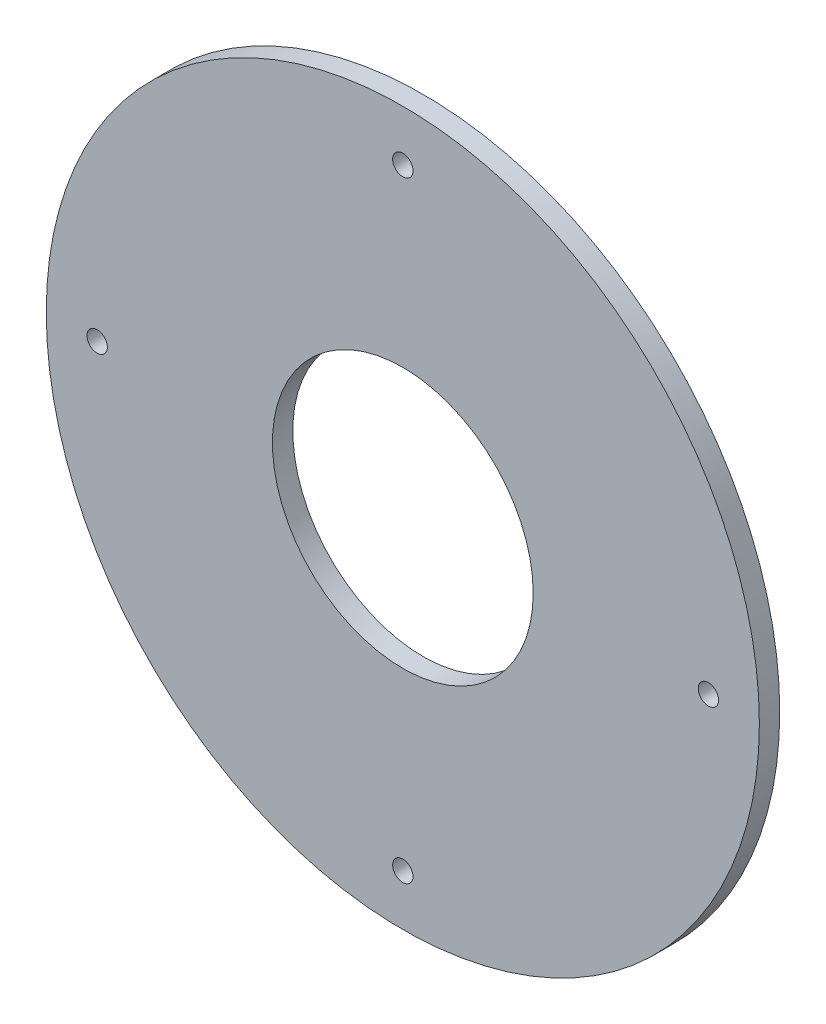
ISO-10303-21;
HEADER;
FILE_DESCRIPTION(('STEP AP214'),'2;1');
FILE_NAME('part.step','',(''),(''),'','','');
FILE_SCHEMA(('AUTOMOTIVE_DESIGN { 1 0 10303 214 1 1 1 1 }'));
ENDSEC;
DATA;
#1=APPLICATION_CONTEXT('core data for automotive mechanical design processes');
#2=APPLICATION_PROTOCOL_DEFINITION('international standard','automotive_design',2000,#1);
#3=PRODUCT_CONTEXT('',#1,'mechanical');
#4=PRODUCT('Part','Part','',(#3));
#5=PRODUCT_RELATED_PRODUCT_CATEGORY('part','',(#4));
#6=PRODUCT_DEFINITION_FORMATION('','',#4);
#7=PRODUCT_DEFINITION_CONTEXT('part definition',#1,'design');
#8=PRODUCT_DEFINITION('design','',#6,#7);
#9=PRODUCT_DEFINITION_SHAPE('','',#8);
#10=(LENGTH_UNIT() NAMED_UNIT(*) SI_UNIT(.MILLI.,.METRE.));
#11=(NAMED_UNIT(*) PLANE_ANGLE_UNIT() SI_UNIT($,.RADIAN.));
#12=(NAMED_UNIT(*) SI_UNIT($,.STERADIAN.) SOLID_ANGLE_UNIT());
#13=UNCERTAINTY_MEASURE_WITH_UNIT(LENGTH_MEASURE(1.E-05),#10,'distance_accuracy_value','');
#14=(GEOMETRIC_REPRESENTATION_CONTEXT(3) GLOBAL_UNCERTAINTY_ASSIGNED_CONTEXT((#13)) GLOBAL_UNIT_ASSIGNED_CONTEXT((#10,
#11,#12)) REPRESENTATION_CONTEXT('',''));
#15=CARTESIAN_POINT('',(0.,0.,0.));
#16=DIRECTION('',(0.,0.,1.));
#17=DIRECTION('',(1.,0.,0.));
#18=AXIS2_PLACEMENT_3D('',#15,#16,#17);
#19=CARTESIAN_POINT('',(7.51863873740927,-0.377040866930098,0.));
#20=DIRECTION('',(0.,0.,1.));
#21=DIRECTION('',(1.,0.,0.));
#22=AXIS2_PLACEMENT_3D('',#19,#20,#21);
#23=PLANE('',#22);
#24=CARTESIAN_POINT('',(82.5186387374093,-0.377040866930096,0.));
#25=DIRECTION('',(0.,0.,-1.));
#26=DIRECTION('',(-1.,0.,0.));
#27=AXIS2_PLACEMENT_3D('',#24,#25,#26);
#28=CIRCLE('',#27,2.5);
#29=CARTESIAN_POINT('',(85.0186387374093,-0.377040866930096,0.));
#30=VERTEX_POINT('',#29);
#31=EDGE_CURVE('E106',#30,#30,#28,.T.);
#32=ORIENTED_EDGE('',*,*,#31,.F.);
#33=EDGE_LOOP('',(#32));
#34=FACE_BOUND('',#33,.T.);
#35=CARTESIAN_POINT('',(7.51863873740928,-75.3770408669301,0.));
#36=DIRECTION('',(0.,0.,-1.));
#37=DIRECTION('',(-1.,0.,0.));
#38=AXIS2_PLACEMENT_3D('',#35,#36,#37);
#39=CIRCLE('',#38,2.5);
#40=CARTESIAN_POINT('',(10.0186387374093,-75.3770408669301,0.));
#41=VERTEX_POINT('',#40);
#42=EDGE_CURVE('E121',#41,#41,#39,.T.);
#43=ORIENTED_EDGE('',*,*,#42,.F.);
#44=EDGE_LOOP('',(#43));
#45=FACE_BOUND('',#44,.T.);
#46=CARTESIAN_POINT('',(-67.4813612625907,-0.377040866930096,0.));
#47=DIRECTION('',(0.,0.,-1.));
#48=DIRECTION('',(-1.,0.,0.));
#49=AXIS2_PLACEMENT_3D('',#46,#47,#48);
#50=CIRCLE('',#49,2.5);
#51=CARTESIAN_POINT('',(-64.9813612625907,-0.377040866930096,0.));
#52=VERTEX_POINT('',#51);
#53=EDGE_CURVE('E96',#52,#52,#50,.T.);
#54=ORIENTED_EDGE('',*,*,#53,.F.);
#55=EDGE_LOOP('',(#54));
#56=FACE_BOUND('',#55,.T.);
#57=CARTESIAN_POINT('',(7.51863873740928,74.6229591330699,0.));
#58=DIRECTION('',(0.,0.,-1.));
#59=DIRECTION('',(-1.,0.,0.));
#60=AXIS2_PLACEMENT_3D('',#57,#58,#59);
#61=CIRCLE('',#60,2.5);
#62=CARTESIAN_POINT('',(10.0186387374093,74.6229591330699,0.));
#63=VERTEX_POINT('',#62);
#64=EDGE_CURVE('E90',#63,#63,#61,.T.);
#65=ORIENTED_EDGE('',*,*,#64,.F.);
#66=EDGE_LOOP('',(#65));
#67=FACE_BOUND('',#66,.T.);
#68=CARTESIAN_POINT('',(7.51863873740928,-0.377040866930096,0.));
#69=DIRECTION('',(0.,0.,-1.));
#70=DIRECTION('',(-1.,0.,0.));
#71=AXIS2_PLACEMENT_3D('',#68,#69,#70);
#72=CIRCLE('',#71,32.);
#73=CARTESIAN_POINT('',(39.5186387374093,-0.377040866930092,0.));
#74=VERTEX_POINT('',#73);
#75=EDGE_CURVE('E132',#74,#74,#72,.T.);
#76=ORIENTED_EDGE('',*,*,#75,.F.);
#77=EDGE_LOOP('',(#76));
#78=FACE_BOUND('',#77,.T.);
#79=CARTESIAN_POINT('',(7.51863873740928,-0.377040866930096,0.));
#80=DIRECTION('',(0.,0.,1.));
#81=DIRECTION('',(1.,0.,0.));
#82=AXIS2_PLACEMENT_3D('',#79,#80,#81);
#83=CIRCLE('',#82,87.5);
#84=CARTESIAN_POINT('',(-79.9813612625907,-0.377040866930107,0.));
#85=VERTEX_POINT('',#84);
#86=EDGE_CURVE('E11',#85,#85,#83,.T.);
#87=ORIENTED_EDGE('',*,*,#86,.F.);
#88=EDGE_LOOP('',(#87));
#89=FACE_BOUND('',#88,.T.);
#90=ADVANCED_FACE('F17',(#34,#45,#56,#67,#78,#89),#23,.F.);
#91=CARTESIAN_POINT('',(7.51863873740927,-0.377040866930098,5.));
#92=DIRECTION('',(0.,0.,1.));
#93=DIRECTION('',(1.,0.,0.));
#94=AXIS2_PLACEMENT_3D('',#91,#92,#93);
#95=PLANE('',#94);
#96=CARTESIAN_POINT('',(82.5186387374093,-0.377040866930096,5.));
#97=DIRECTION('',(0.,0.,-1.));
#98=DIRECTION('',(-1.,0.,0.));
#99=AXIS2_PLACEMENT_3D('',#96,#97,#98);
#100=CIRCLE('',#99,2.5);
#101=CARTESIAN_POINT('',(85.0186387374093,-0.377040866930096,5.));
#102=VERTEX_POINT('',#101);
#103=EDGE_CURVE('E176',#102,#102,#100,.T.);
#104=ORIENTED_EDGE('',*,*,#103,.T.);
#105=EDGE_LOOP('',(#104));
#106=FACE_BOUND('',#105,.T.);
#107=CARTESIAN_POINT('',(7.51863873740928,-75.3770408669301,5.));
#108=DIRECTION('',(0.,0.,-1.));
#109=DIRECTION('',(-1.,0.,0.));
#110=AXIS2_PLACEMENT_3D('',#107,#108,#109);
#111=CIRCLE('',#110,2.5);
#112=CARTESIAN_POINT('',(10.0186387374093,-75.3770408669301,5.));
#113=VERTEX_POINT('',#112);
#114=EDGE_CURVE('E107',#113,#113,#111,.T.);
#115=ORIENTED_EDGE('',*,*,#114,.T.);
#116=EDGE_LOOP('',(#115));
#117=FACE_BOUND('',#116,.T.);
#118=CARTESIAN_POINT('',(-67.4813612625907,-0.377040866930096,5.));
#119=DIRECTION('',(0.,0.,-1.));
#120=DIRECTION('',(-1.,0.,0.));
#121=AXIS2_PLACEMENT_3D('',#118,#119,#120);
#122=CIRCLE('',#121,2.5);
#123=CARTESIAN_POINT('',(-64.9813612625907,-0.377040866930096,5.));
#124=VERTEX_POINT('',#123);
#125=EDGE_CURVE('E123',#124,#124,#122,.T.);
#126=ORIENTED_EDGE('',*,*,#125,.T.);
#127=EDGE_LOOP('',(#126));
#128=FACE_BOUND('',#127,.T.);
#129=CARTESIAN_POINT('',(7.51863873740928,74.6229591330699,5.));
#130=DIRECTION('',(0.,0.,-1.));
#131=DIRECTION('',(-1.,0.,0.));
#132=AXIS2_PLACEMENT_3D('',#129,#130,#131);
#133=CIRCLE('',#132,2.5);
#134=CARTESIAN_POINT('',(10.0186387374093,74.6229591330699,5.));
#135=VERTEX_POINT('',#134);
#136=EDGE_CURVE('E87',#135,#135,#133,.T.);
#137=ORIENTED_EDGE('',*,*,#136,.T.);
#138=EDGE_LOOP('',(#137));
#139=FACE_BOUND('',#138,.T.);
#140=CARTESIAN_POINT('',(7.51863873740928,-0.377040866930096,5.));
#141=DIRECTION('',(0.,0.,-1.));
#142=DIRECTION('',(-1.,0.,0.));
#143=AXIS2_PLACEMENT_3D('',#140,#141,#142);
#144=CIRCLE('',#143,32.);
#145=CARTESIAN_POINT('',(39.5186387374093,-0.377040866930092,5.));
#146=VERTEX_POINT('',#145);
#147=EDGE_CURVE('E114',#146,#146,#144,.T.);
#148=ORIENTED_EDGE('',*,*,#147,.T.);
#149=EDGE_LOOP('',(#148));
#150=FACE_BOUND('',#149,.T.);
#151=CARTESIAN_POINT('',(7.51863873740928,-0.377040866930096,5.));
#152=DIRECTION('',(0.,0.,1.));
#153=DIRECTION('',(1.,0.,0.));
#154=AXIS2_PLACEMENT_3D('',#151,#152,#153);
#155=CIRCLE('',#154,87.5);
#156=CARTESIAN_POINT('',(-79.9813612625907,-0.377040866930107,5.));
#157=VERTEX_POINT('',#156);
#158=EDGE_CURVE('E137',#157,#157,#155,.T.);
#159=ORIENTED_EDGE('',*,*,#158,.T.);
#160=EDGE_LOOP('',(#159));
#161=FACE_BOUND('',#160,.T.);
#162=ADVANCED_FACE('F91',(#106,#117,#128,#139,#150,#161),#95,.T.);
#163=CARTESIAN_POINT('',(7.51863873740928,-0.377040866930096,0.));
#164=DIRECTION('',(0.,0.,1.));
#165=DIRECTION('',(1.,0.,0.));
#166=AXIS2_PLACEMENT_3D('',#163,#164,#165);
#167=CYLINDRICAL_SURFACE('',#166,87.5);
#168=ORIENTED_EDGE('',*,*,#158,.F.);
#169=DIRECTION('',(0.,0.,-1.));
#170=VECTOR('',#169,1.);
#171=CARTESIAN_POINT('',(-79.9813612625907,-0.377040866930107,0.));
#172=LINE('',#171,#170);
#173=EDGE_CURVE('E25',#157,#85,#172,.T.);
#174=ORIENTED_EDGE('',*,*,#173,.T.);
#175=ORIENTED_EDGE('',*,*,#86,.T.);
#176=ORIENTED_EDGE('',*,*,#173,.F.);
#177=EDGE_LOOP('',(#168,#174,#175,#176));
#178=FACE_BOUND('',#177,.T.);
#179=ADVANCED_FACE('F143',(#178),#167,.T.);
#180=CARTESIAN_POINT('',(7.51863873740928,-0.377040866930096,0.));
#181=DIRECTION('',(0.,0.,1.));
#182=DIRECTION('',(-1.,0.,0.));
#183=AXIS2_PLACEMENT_3D('',#180,#181,#182);
#184=CYLINDRICAL_SURFACE('',#183,32.);
#185=ORIENTED_EDGE('',*,*,#147,.F.);
#186=DIRECTION('',(0.,0.,-1.));
#187=VECTOR('',#186,1.);
#188=CARTESIAN_POINT('',(39.5186387374093,-0.377040866930092,0.));
#189=LINE('',#188,#187);
#190=EDGE_CURVE('E117',#146,#74,#189,.T.);
#191=ORIENTED_EDGE('',*,*,#190,.T.);
#192=ORIENTED_EDGE('',*,*,#75,.T.);
#193=ORIENTED_EDGE('',*,*,#190,.F.);
#194=EDGE_LOOP('',(#185,#191,#192,#193));
#195=FACE_BOUND('',#194,.T.);
#196=ADVANCED_FACE('F147',(#195),#184,.F.);
#197=CARTESIAN_POINT('',(7.51863873740928,74.6229591330699,0.));
#198=DIRECTION('',(0.,0.,1.));
#199=DIRECTION('',(-1.,0.,0.));
#200=AXIS2_PLACEMENT_3D('',#197,#198,#199);
#201=CYLINDRICAL_SURFACE('',#200,2.5);
#202=ORIENTED_EDGE('',*,*,#136,.F.);
#203=DIRECTION('',(0.,0.,-1.));
#204=VECTOR('',#203,1.);
#205=CARTESIAN_POINT('',(10.0186387374093,74.6229591330699,0.));
#206=LINE('',#205,#204);
#207=EDGE_CURVE('E81',#135,#63,#206,.T.);
#208=ORIENTED_EDGE('',*,*,#207,.T.);
#209=ORIENTED_EDGE('',*,*,#64,.T.);
#210=ORIENTED_EDGE('',*,*,#207,.F.);
#211=EDGE_LOOP('',(#202,#208,#209,#210));
#212=FACE_BOUND('',#211,.T.);
#213=ADVANCED_FACE('F88',(#212),#201,.F.);
#214=CARTESIAN_POINT('',(-67.4813612625907,-0.377040866930096,0.));
#215=DIRECTION('',(0.,0.,1.));
#216=DIRECTION('',(-1.,0.,0.));
#217=AXIS2_PLACEMENT_3D('',#214,#215,#216);
#218=CYLINDRICAL_SURFACE('',#217,2.5);
#219=ORIENTED_EDGE('',*,*,#125,.F.);
#220=DIRECTION('',(0.,0.,-1.));
#221=VECTOR('',#220,1.);
#222=CARTESIAN_POINT('',(-64.9813612625907,-0.377040866930096,0.));
#223=LINE('',#222,#221);
#224=EDGE_CURVE('E105',#124,#52,#223,.T.);
#225=ORIENTED_EDGE('',*,*,#224,.T.);
#226=ORIENTED_EDGE('',*,*,#53,.T.);
#227=ORIENTED_EDGE('',*,*,#224,.F.);
#228=EDGE_LOOP('',(#219,#225,#226,#227));
#229=FACE_BOUND('',#228,.T.);
#230=ADVANCED_FACE('F161',(#229),#218,.F.);
#231=CARTESIAN_POINT('',(7.51863873740928,-75.3770408669301,0.));
#232=DIRECTION('',(0.,0.,1.));
#233=DIRECTION('',(-1.,0.,0.));
#234=AXIS2_PLACEMENT_3D('',#231,#232,#233);
#235=CYLINDRICAL_SURFACE('',#234,2.5);
#236=ORIENTED_EDGE('',*,*,#114,.F.);
#237=DIRECTION('',(0.,0.,-1.));
#238=VECTOR('',#237,1.);
#239=CARTESIAN_POINT('',(10.0186387374093,-75.3770408669301,0.));
#240=LINE('',#239,#238);
#241=EDGE_CURVE('E115',#113,#41,#240,.T.);
#242=ORIENTED_EDGE('',*,*,#241,.T.);
#243=ORIENTED_EDGE('',*,*,#42,.T.);
#244=ORIENTED_EDGE('',*,*,#241,.F.);
#245=EDGE_LOOP('',(#236,#242,#243,#244));
#246=FACE_BOUND('',#245,.T.);
#247=ADVANCED_FACE('F163',(#246),#235,.F.);
#248=CARTESIAN_POINT('',(82.5186387374093,-0.377040866930096,0.));
#249=DIRECTION('',(0.,0.,1.));
#250=DIRECTION('',(-1.,0.,0.));
#251=AXIS2_PLACEMENT_3D('',#248,#249,#250);
#252=CYLINDRICAL_SURFACE('',#251,2.5);
#253=ORIENTED_EDGE('',*,*,#103,.F.);
#254=DIRECTION('',(0.,0.,-1.));
#255=VECTOR('',#254,1.);
#256=CARTESIAN_POINT('',(85.0186387374093,-0.377040866930096,0.));
#257=LINE('',#256,#255);
#258=EDGE_CURVE('E180',#102,#30,#257,.T.);
#259=ORIENTED_EDGE('',*,*,#258,.T.);
#260=ORIENTED_EDGE('',*,*,#31,.T.);
#261=ORIENTED_EDGE('',*,*,#258,.F.);
#262=EDGE_LOOP('',(#253,#259,#260,#261));
#263=FACE_BOUND('',#262,.T.);
#264=ADVANCED_FACE('F169',(#263),#252,.F.);
#265=CLOSED_SHELL('',(#90,#162,#179,#196,#213,#230,#247,#264));
#266=MANIFOLD_SOLID_BREP('B1',#265);
#267=ADVANCED_BREP_SHAPE_REPRESENTATION('',(#18,#266),#14);
#268=SHAPE_DEFINITION_REPRESENTATION(#9,#267);
ENDSEC;
END-ISO-10303-21;
